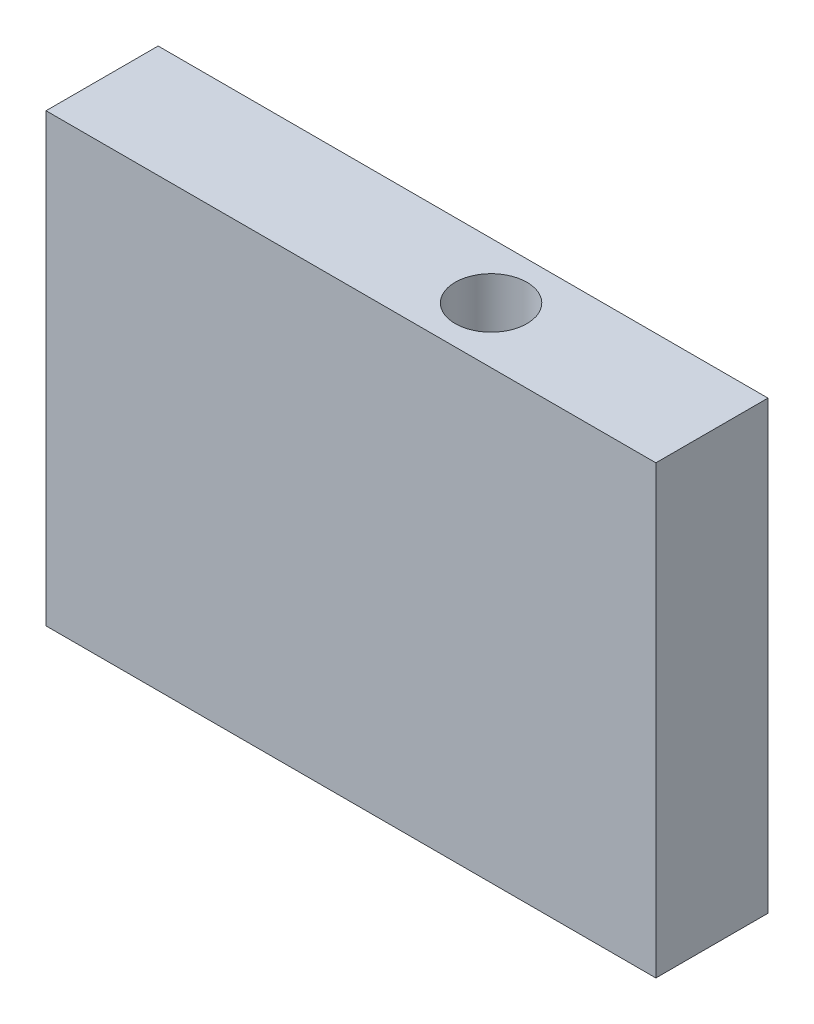
ISO-10303-21;
HEADER;
FILE_DESCRIPTION(('STEP AP214'),'2;1');
FILE_NAME('part.step','',(''),(''),'','','');
FILE_SCHEMA(('AUTOMOTIVE_DESIGN { 1 0 10303 214 1 1 1 1 }'));
ENDSEC;
DATA;
#1=APPLICATION_CONTEXT('core data for automotive mechanical design processes');
#2=APPLICATION_PROTOCOL_DEFINITION('international standard','automotive_design',2000,#1);
#3=PRODUCT_CONTEXT('',#1,'mechanical');
#4=PRODUCT('Part','Part','',(#3));
#5=PRODUCT_RELATED_PRODUCT_CATEGORY('part','',(#4));
#6=PRODUCT_DEFINITION_FORMATION('','',#4);
#7=PRODUCT_DEFINITION_CONTEXT('part definition',#1,'design');
#8=PRODUCT_DEFINITION('design','',#6,#7);
#9=PRODUCT_DEFINITION_SHAPE('','',#8);
#10=(LENGTH_UNIT() NAMED_UNIT(*) SI_UNIT(.MILLI.,.METRE.));
#11=(NAMED_UNIT(*) PLANE_ANGLE_UNIT() SI_UNIT($,.RADIAN.));
#12=(NAMED_UNIT(*) SI_UNIT($,.STERADIAN.) SOLID_ANGLE_UNIT());
#13=UNCERTAINTY_MEASURE_WITH_UNIT(LENGTH_MEASURE(1.E-05),#10,'distance_accuracy_value','');
#14=(GEOMETRIC_REPRESENTATION_CONTEXT(3) GLOBAL_UNCERTAINTY_ASSIGNED_CONTEXT((#13)) GLOBAL_UNIT_ASSIGNED_CONTEXT((#10,
#11,#12)) REPRESENTATION_CONTEXT('',''));
#15=CARTESIAN_POINT('',(0.,0.,0.));
#16=DIRECTION('',(0.,0.,1.));
#17=DIRECTION('',(1.,0.,0.));
#18=AXIS2_PLACEMENT_3D('',#15,#16,#17);
#19=CARTESIAN_POINT('',(0.,0.,5.));
#20=DIRECTION('',(-1.,0.,0.));
#21=DIRECTION('',(0.,-1.,0.));
#22=AXIS2_PLACEMENT_3D('',#19,#20,#21);
#23=PLANE('',#22);
#24=DIRECTION('',(0.,1.,0.));
#25=VECTOR('',#24,1.);
#26=CARTESIAN_POINT('',(0.,0.,0.));
#27=LINE('',#26,#25);
#28=CARTESIAN_POINT('',(0.,0.,0.));
#29=VERTEX_POINT('',#28);
#30=CARTESIAN_POINT('',(0.,19.9,0.));
#31=VERTEX_POINT('',#30);
#32=EDGE_CURVE('E93',#29,#31,#27,.T.);
#33=ORIENTED_EDGE('',*,*,#32,.T.);
#34=DIRECTION('',(0.,0.,-1.));
#35=VECTOR('',#34,1.);
#36=CARTESIAN_POINT('',(0.,19.9,5.));
#37=LINE('',#36,#35);
#38=CARTESIAN_POINT('',(0.,19.9,5.));
#39=VERTEX_POINT('',#38);
#40=EDGE_CURVE('E11',#39,#31,#37,.T.);
#41=ORIENTED_EDGE('',*,*,#40,.F.);
#42=DIRECTION('',(0.,1.,0.));
#43=VECTOR('',#42,1.);
#44=CARTESIAN_POINT('',(0.,0.,5.));
#45=LINE('',#44,#43);
#46=CARTESIAN_POINT('',(0.,0.,5.));
#47=VERTEX_POINT('',#46);
#48=EDGE_CURVE('E81',#47,#39,#45,.T.);
#49=ORIENTED_EDGE('',*,*,#48,.F.);
#50=DIRECTION('',(0.,0.,-1.));
#51=VECTOR('',#50,1.);
#52=CARTESIAN_POINT('',(0.,0.,5.));
#53=LINE('',#52,#51);
#54=EDGE_CURVE('E89',#47,#29,#53,.T.);
#55=ORIENTED_EDGE('',*,*,#54,.T.);
#56=EDGE_LOOP('',(#33,#41,#49,#55));
#57=FACE_BOUND('',#56,.T.);
#58=ADVANCED_FACE('F30',(#57),#23,.F.);
#59=CARTESIAN_POINT('',(0.,19.9,5.));
#60=DIRECTION('',(0.,-1.,0.));
#61=DIRECTION('',(1.,0.,0.));
#62=AXIS2_PLACEMENT_3D('',#59,#60,#61);
#63=PLANE('',#62);
#64=CARTESIAN_POINT('',(-9.84999999999997,19.9,2.5));
#65=DIRECTION('',(0.,1.,0.));
#66=DIRECTION('',(-1.,0.,0.));
#67=AXIS2_PLACEMENT_3D('',#64,#65,#66);
#68=CIRCLE('',#67,1.60000000000005);
#69=CARTESIAN_POINT('',(-11.45,19.9,2.5));
#70=VERTEX_POINT('',#69);
#71=EDGE_CURVE('E107',#70,#70,#68,.T.);
#72=ORIENTED_EDGE('',*,*,#71,.F.);
#73=EDGE_LOOP('',(#72));
#74=FACE_BOUND('',#73,.T.);
#75=DIRECTION('',(-1.,0.,0.));
#76=VECTOR('',#75,1.);
#77=CARTESIAN_POINT('',(0.,19.9,0.));
#78=LINE('',#77,#76);
#79=CARTESIAN_POINT('',(-27.2000000000002,19.9,0.));
#80=VERTEX_POINT('',#79);
#81=EDGE_CURVE('E85',#31,#80,#78,.T.);
#82=ORIENTED_EDGE('',*,*,#81,.T.);
#83=DIRECTION('',(0.,0.,-1.));
#84=VECTOR('',#83,1.);
#85=CARTESIAN_POINT('',(-27.2000000000002,19.9,5.));
#86=LINE('',#85,#84);
#87=CARTESIAN_POINT('',(-27.2000000000002,19.9,5.));
#88=VERTEX_POINT('',#87);
#89=EDGE_CURVE('E38',#88,#80,#86,.T.);
#90=ORIENTED_EDGE('',*,*,#89,.F.);
#91=DIRECTION('',(-1.,0.,0.));
#92=VECTOR('',#91,1.);
#93=CARTESIAN_POINT('',(0.,19.9,5.));
#94=LINE('',#93,#92);
#95=EDGE_CURVE('E76',#39,#88,#94,.T.);
#96=ORIENTED_EDGE('',*,*,#95,.F.);
#97=ORIENTED_EDGE('',*,*,#40,.T.);
#98=EDGE_LOOP('',(#82,#90,#96,#97));
#99=FACE_BOUND('',#98,.T.);
#100=ADVANCED_FACE('F84',(#74,#99),#63,.F.);
#101=CARTESIAN_POINT('',(-27.2000000000002,0.,5.));
#102=DIRECTION('',(1.,0.,0.));
#103=DIRECTION('',(0.,0.,-1.));
#104=AXIS2_PLACEMENT_3D('',#101,#102,#103);
#105=PLANE('',#104);
#106=DIRECTION('',(0.,-1.,0.));
#107=VECTOR('',#106,1.);
#108=CARTESIAN_POINT('',(-27.2000000000002,0.,0.));
#109=LINE('',#108,#107);
#110=CARTESIAN_POINT('',(-27.2000000000002,0.,0.));
#111=VERTEX_POINT('',#110);
#112=EDGE_CURVE('E63',#80,#111,#109,.T.);
#113=ORIENTED_EDGE('',*,*,#112,.T.);
#114=DIRECTION('',(0.,0.,-1.));
#115=VECTOR('',#114,1.);
#116=CARTESIAN_POINT('',(-27.2000000000002,0.,5.));
#117=LINE('',#116,#115);
#118=CARTESIAN_POINT('',(-27.2000000000002,0.,5.));
#119=VERTEX_POINT('',#118);
#120=EDGE_CURVE('E86',#119,#111,#117,.T.);
#121=ORIENTED_EDGE('',*,*,#120,.F.);
#122=DIRECTION('',(0.,-1.,0.));
#123=VECTOR('',#122,1.);
#124=CARTESIAN_POINT('',(-27.2000000000002,0.,5.));
#125=LINE('',#124,#123);
#126=EDGE_CURVE('E79',#88,#119,#125,.T.);
#127=ORIENTED_EDGE('',*,*,#126,.F.);
#128=ORIENTED_EDGE('',*,*,#89,.T.);
#129=EDGE_LOOP('',(#113,#121,#127,#128));
#130=FACE_BOUND('',#129,.T.);
#131=ADVANCED_FACE('F87',(#130),#105,.F.);
#132=CARTESIAN_POINT('',(0.,0.,5.));
#133=DIRECTION('',(0.,1.,0.));
#134=DIRECTION('',(-1.,0.,0.));
#135=AXIS2_PLACEMENT_3D('',#132,#133,#134);
#136=PLANE('',#135);
#137=CARTESIAN_POINT('',(-9.84999999999996,0.,2.5));
#138=DIRECTION('',(0.,1.,0.));
#139=DIRECTION('',(-1.,0.,0.));
#140=AXIS2_PLACEMENT_3D('',#137,#138,#139);
#141=CIRCLE('',#140,1.60000000000005);
#142=CARTESIAN_POINT('',(-11.45,0.,2.5));
#143=VERTEX_POINT('',#142);
#144=EDGE_CURVE('E96',#143,#143,#141,.T.);
#145=ORIENTED_EDGE('',*,*,#144,.T.);
#146=EDGE_LOOP('',(#145));
#147=FACE_BOUND('',#146,.T.);
#148=DIRECTION('',(1.,0.,0.));
#149=VECTOR('',#148,1.);
#150=CARTESIAN_POINT('',(0.,0.,0.));
#151=LINE('',#150,#149);
#152=EDGE_CURVE('E69',#111,#29,#151,.T.);
#153=ORIENTED_EDGE('',*,*,#152,.T.);
#154=ORIENTED_EDGE('',*,*,#54,.F.);
#155=DIRECTION('',(1.,0.,0.));
#156=VECTOR('',#155,1.);
#157=CARTESIAN_POINT('',(0.,0.,5.));
#158=LINE('',#157,#156);
#159=EDGE_CURVE('E46',#119,#47,#158,.T.);
#160=ORIENTED_EDGE('',*,*,#159,.F.);
#161=ORIENTED_EDGE('',*,*,#120,.T.);
#162=EDGE_LOOP('',(#153,#154,#160,#161));
#163=FACE_BOUND('',#162,.T.);
#164=ADVANCED_FACE('F101',(#147,#163),#136,.F.);
#165=CARTESIAN_POINT('',(0.,19.9,5.));
#166=DIRECTION('',(0.,0.,1.));
#167=DIRECTION('',(1.,0.,0.));
#168=AXIS2_PLACEMENT_3D('',#165,#166,#167);
#169=PLANE('',#168);
#170=ORIENTED_EDGE('',*,*,#48,.T.);
#171=ORIENTED_EDGE('',*,*,#95,.T.);
#172=ORIENTED_EDGE('',*,*,#126,.T.);
#173=ORIENTED_EDGE('',*,*,#159,.T.);
#174=EDGE_LOOP('',(#170,#171,#172,#173));
#175=FACE_BOUND('',#174,.T.);
#176=ADVANCED_FACE('F77',(#175),#169,.T.);
#177=CARTESIAN_POINT('',(0.,19.9,0.));
#178=DIRECTION('',(0.,0.,1.));
#179=DIRECTION('',(1.,0.,0.));
#180=AXIS2_PLACEMENT_3D('',#177,#178,#179);
#181=PLANE('',#180);
#182=ORIENTED_EDGE('',*,*,#32,.F.);
#183=ORIENTED_EDGE('',*,*,#152,.F.);
#184=ORIENTED_EDGE('',*,*,#112,.F.);
#185=ORIENTED_EDGE('',*,*,#81,.F.);
#186=EDGE_LOOP('',(#182,#183,#184,#185));
#187=FACE_BOUND('',#186,.T.);
#188=ADVANCED_FACE('F104',(#187),#181,.F.);
#189=CARTESIAN_POINT('',(-9.84999999999996,0.,2.5));
#190=DIRECTION('',(0.,1.,0.));
#191=DIRECTION('',(-1.,0.,0.));
#192=AXIS2_PLACEMENT_3D('',#189,#190,#191);
#193=CYLINDRICAL_SURFACE('',#192,1.60000000000005);
#194=ORIENTED_EDGE('',*,*,#144,.F.);
#195=EDGE_LOOP('',(#194));
#196=FACE_BOUND('',#195,.T.);
#197=ORIENTED_EDGE('',*,*,#71,.T.);
#198=EDGE_LOOP('',(#197));
#199=FACE_BOUND('',#198,.T.);
#200=ADVANCED_FACE('F114',(#196,#199),#193,.F.);
#201=CLOSED_SHELL('',(#58,#100,#131,#164,#176,#188,#200));
#202=MANIFOLD_SOLID_BREP('B2',#201);
#203=ADVANCED_BREP_SHAPE_REPRESENTATION('',(#18,#202),#14);
#204=SHAPE_DEFINITION_REPRESENTATION(#9,#203);
ENDSEC;
END-ISO-10303-21;
